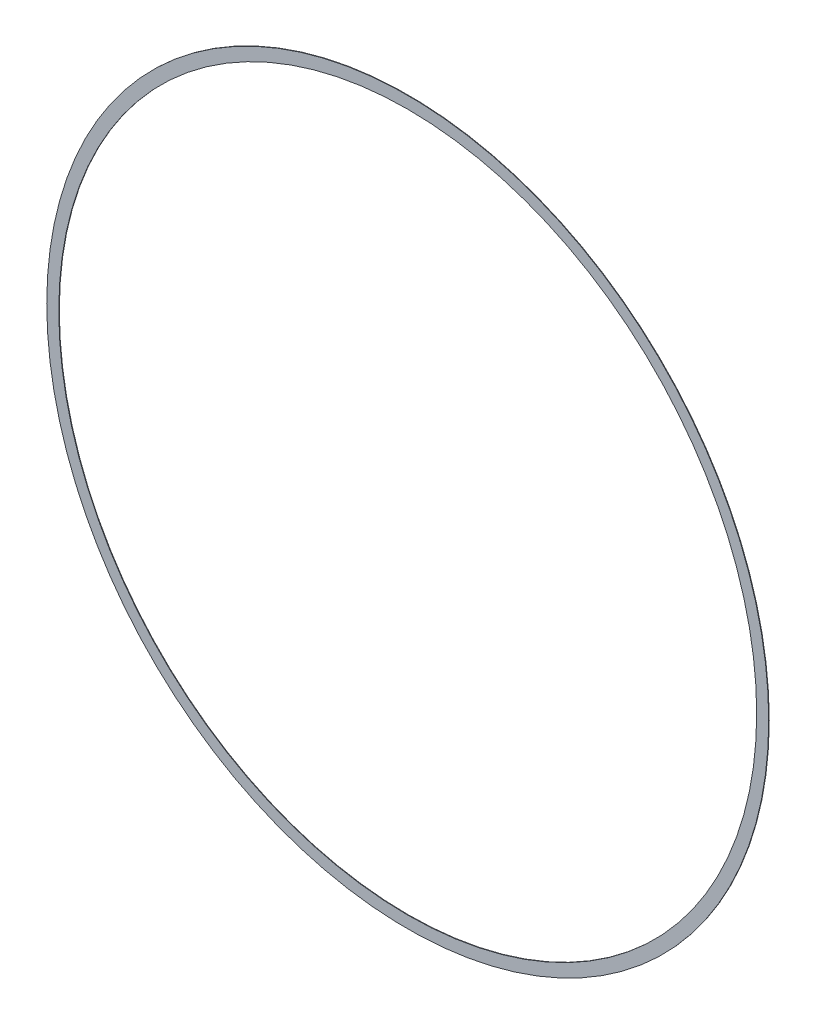
ISO-10303-21;
HEADER;
FILE_DESCRIPTION(('STEP AP214'),'2;1');
FILE_NAME('part.step','',(''),(''),'','','');
FILE_SCHEMA(('AUTOMOTIVE_DESIGN { 1 0 10303 214 1 1 1 1 }'));
ENDSEC;
DATA;
#1=APPLICATION_CONTEXT('core data for automotive mechanical design processes');
#2=APPLICATION_PROTOCOL_DEFINITION('international standard','automotive_design',2000,#1);
#3=PRODUCT_CONTEXT('',#1,'mechanical');
#4=PRODUCT('Part','Part','',(#3));
#5=PRODUCT_RELATED_PRODUCT_CATEGORY('part','',(#4));
#6=PRODUCT_DEFINITION_FORMATION('','',#4);
#7=PRODUCT_DEFINITION_CONTEXT('part definition',#1,'design');
#8=PRODUCT_DEFINITION('design','',#6,#7);
#9=PRODUCT_DEFINITION_SHAPE('','',#8);
#10=(LENGTH_UNIT() NAMED_UNIT(*) SI_UNIT(.MILLI.,.METRE.));
#11=(NAMED_UNIT(*) PLANE_ANGLE_UNIT() SI_UNIT($,.RADIAN.));
#12=(NAMED_UNIT(*) SI_UNIT($,.STERADIAN.) SOLID_ANGLE_UNIT());
#13=UNCERTAINTY_MEASURE_WITH_UNIT(LENGTH_MEASURE(1.E-05),#10,'distance_accuracy_value','');
#14=(GEOMETRIC_REPRESENTATION_CONTEXT(3) GLOBAL_UNCERTAINTY_ASSIGNED_CONTEXT((#13)) GLOBAL_UNIT_ASSIGNED_CONTEXT((#10,
#11,#12)) REPRESENTATION_CONTEXT('',''));
#15=CARTESIAN_POINT('',(0.,0.,0.));
#16=DIRECTION('',(0.,0.,1.));
#17=DIRECTION('',(1.,0.,0.));
#18=AXIS2_PLACEMENT_3D('',#15,#16,#17);
#19=CARTESIAN_POINT('',(0.,0.,1.1));
#20=DIRECTION('',(0.,0.,1.));
#21=DIRECTION('',(1.,0.,0.));
#22=AXIS2_PLACEMENT_3D('',#19,#20,#21);
#23=PLANE('',#22);
#24=CARTESIAN_POINT('',(0.,0.,1.1));
#25=DIRECTION('',(0.,0.,1.));
#26=DIRECTION('',(1.,0.,0.));
#27=AXIS2_PLACEMENT_3D('',#24,#25,#26);
#28=CIRCLE('',#27,750.);
#29=CARTESIAN_POINT('',(750.,0.,1.1));
#30=VERTEX_POINT('',#29);
#31=EDGE_CURVE('E10',#30,#30,#28,.T.);
#32=ORIENTED_EDGE('',*,*,#31,.T.);
#33=EDGE_LOOP('',(#32));
#34=FACE_BOUND('',#33,.T.);
#35=CARTESIAN_POINT('',(0.,0.,1.1));
#36=DIRECTION('',(0.,0.,1.));
#37=DIRECTION('',(1.,0.,0.));
#38=AXIS2_PLACEMENT_3D('',#35,#36,#37);
#39=CIRCLE('',#38,725.);
#40=CARTESIAN_POINT('',(725.,0.,1.1));
#41=VERTEX_POINT('',#40);
#42=EDGE_CURVE('E50',#41,#41,#39,.T.);
#43=ORIENTED_EDGE('',*,*,#42,.F.);
#44=EDGE_LOOP('',(#43));
#45=FACE_BOUND('',#44,.T.);
#46=ADVANCED_FACE('F39',(#34,#45),#23,.T.);
#47=CARTESIAN_POINT('',(0.,0.,0.));
#48=DIRECTION('',(0.,0.,1.));
#49=DIRECTION('',(1.,0.,0.));
#50=AXIS2_PLACEMENT_3D('',#47,#48,#49);
#51=PLANE('',#50);
#52=CARTESIAN_POINT('',(0.,0.,0.));
#53=DIRECTION('',(0.,0.,1.));
#54=DIRECTION('',(1.,0.,0.));
#55=AXIS2_PLACEMENT_3D('',#52,#53,#54);
#56=CIRCLE('',#55,750.);
#57=CARTESIAN_POINT('',(750.,0.,0.));
#58=VERTEX_POINT('',#57);
#59=EDGE_CURVE('E43',#58,#58,#56,.T.);
#60=ORIENTED_EDGE('',*,*,#59,.F.);
#61=EDGE_LOOP('',(#60));
#62=FACE_BOUND('',#61,.T.);
#63=CARTESIAN_POINT('',(0.,0.,0.));
#64=DIRECTION('',(0.,0.,1.));
#65=DIRECTION('',(1.,0.,0.));
#66=AXIS2_PLACEMENT_3D('',#63,#64,#65);
#67=CIRCLE('',#66,725.);
#68=CARTESIAN_POINT('',(725.,0.,0.));
#69=VERTEX_POINT('',#68);
#70=EDGE_CURVE('E52',#69,#69,#67,.T.);
#71=ORIENTED_EDGE('',*,*,#70,.T.);
#72=EDGE_LOOP('',(#71));
#73=FACE_BOUND('',#72,.T.);
#74=ADVANCED_FACE('F62',(#62,#73),#51,.F.);
#75=CARTESIAN_POINT('',(0.,0.,1.1));
#76=DIRECTION('',(0.,0.,-1.));
#77=DIRECTION('',(-1.,0.,0.));
#78=AXIS2_PLACEMENT_3D('',#75,#76,#77);
#79=CYLINDRICAL_SURFACE('',#78,750.);
#80=ORIENTED_EDGE('',*,*,#31,.F.);
#81=EDGE_LOOP('',(#80));
#82=FACE_BOUND('',#81,.T.);
#83=ORIENTED_EDGE('',*,*,#59,.T.);
#84=EDGE_LOOP('',(#83));
#85=FACE_BOUND('',#84,.T.);
#86=ADVANCED_FACE('F41',(#82,#85),#79,.T.);
#87=CARTESIAN_POINT('',(0.,0.,1.1));
#88=DIRECTION('',(0.,0.,-1.));
#89=DIRECTION('',(-1.,0.,0.));
#90=AXIS2_PLACEMENT_3D('',#87,#88,#89);
#91=CYLINDRICAL_SURFACE('',#90,725.);
#92=ORIENTED_EDGE('',*,*,#42,.T.);
#93=EDGE_LOOP('',(#92));
#94=FACE_BOUND('',#93,.T.);
#95=ORIENTED_EDGE('',*,*,#70,.F.);
#96=EDGE_LOOP('',(#95));
#97=FACE_BOUND('',#96,.T.);
#98=ADVANCED_FACE('F58',(#94,#97),#91,.F.);
#99=CLOSED_SHELL('',(#46,#74,#86,#98));
#100=MANIFOLD_SOLID_BREP('B2',#99);
#101=ADVANCED_BREP_SHAPE_REPRESENTATION('',(#18,#100),#14);
#102=SHAPE_DEFINITION_REPRESENTATION(#9,#101);
ENDSEC;
END-ISO-10303-21;
